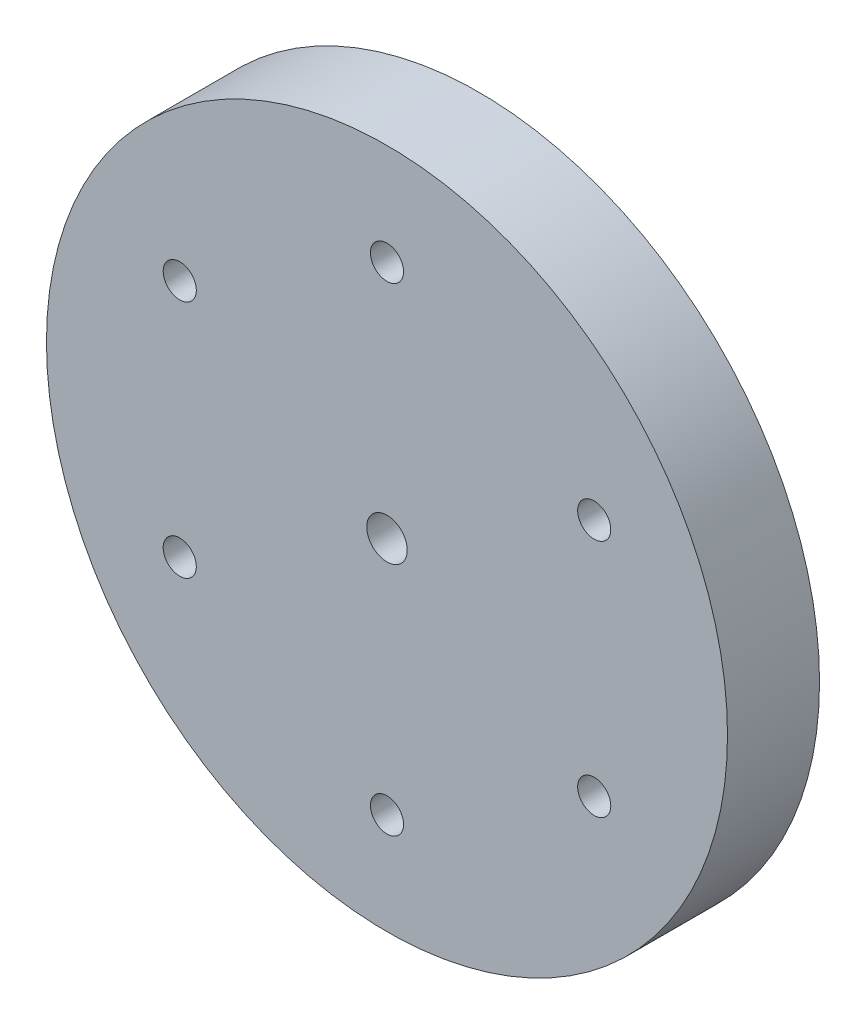
ISO-10303-21;
HEADER;
FILE_DESCRIPTION(('STEP AP214'),'2;1');
FILE_NAME('part.step','',(''),(''),'','','');
FILE_SCHEMA(('AUTOMOTIVE_DESIGN { 1 0 10303 214 1 1 1 1 }'));
ENDSEC;
DATA;
#1=APPLICATION_CONTEXT('core data for automotive mechanical design processes');
#2=APPLICATION_PROTOCOL_DEFINITION('international standard','automotive_design',2000,#1);
#3=PRODUCT_CONTEXT('',#1,'mechanical');
#4=PRODUCT('Part','Part','',(#3));
#5=PRODUCT_RELATED_PRODUCT_CATEGORY('part','',(#4));
#6=PRODUCT_DEFINITION_FORMATION('','',#4);
#7=PRODUCT_DEFINITION_CONTEXT('part definition',#1,'design');
#8=PRODUCT_DEFINITION('design','',#6,#7);
#9=PRODUCT_DEFINITION_SHAPE('','',#8);
#10=(LENGTH_UNIT() NAMED_UNIT(*) SI_UNIT(.MILLI.,.METRE.));
#11=(NAMED_UNIT(*) PLANE_ANGLE_UNIT() SI_UNIT($,.RADIAN.));
#12=(NAMED_UNIT(*) SI_UNIT($,.STERADIAN.) SOLID_ANGLE_UNIT());
#13=UNCERTAINTY_MEASURE_WITH_UNIT(LENGTH_MEASURE(1.E-05),#10,'distance_accuracy_value','');
#14=(GEOMETRIC_REPRESENTATION_CONTEXT(3) GLOBAL_UNCERTAINTY_ASSIGNED_CONTEXT((#13)) GLOBAL_UNIT_ASSIGNED_CONTEXT((#10,
#11,#12)) REPRESENTATION_CONTEXT('',''));
#15=CARTESIAN_POINT('',(0.,0.,0.));
#16=DIRECTION('',(0.,0.,1.));
#17=DIRECTION('',(1.,0.,0.));
#18=AXIS2_PLACEMENT_3D('',#15,#16,#17);
#19=CARTESIAN_POINT('',(0.,0.,2.5));
#20=DIRECTION('',(0.,0.,1.));
#21=DIRECTION('',(1.,0.,0.));
#22=AXIS2_PLACEMENT_3D('',#19,#20,#21);
#23=PLANE('',#22);
#24=CARTESIAN_POINT('',(-11.2583302491976,6.50000000000013,2.5));
#25=DIRECTION('',(0.,0.,1.));
#26=DIRECTION('',(0.50000000000001,0.866025403784433,0.));
#27=AXIS2_PLACEMENT_3D('',#24,#25,#26);
#28=CIRCLE('',#27,0.9);
#29=CARTESIAN_POINT('',(-10.8083302491976,7.27942286340612,2.5));
#30=VERTEX_POINT('',#29);
#31=EDGE_CURVE('E74',#30,#30,#28,.T.);
#32=ORIENTED_EDGE('',*,*,#31,.F.);
#33=EDGE_LOOP('',(#32));
#34=FACE_BOUND('',#33,.T.);
#35=CARTESIAN_POINT('',(-11.2583302491978,-6.4999999999999,2.5));
#36=DIRECTION('',(0.,0.,1.));
#37=DIRECTION('',(-0.499999999999992,0.866025403784443,0.));
#38=AXIS2_PLACEMENT_3D('',#35,#36,#37);
#39=CIRCLE('',#38,0.9);
#40=CARTESIAN_POINT('',(-11.7083302491978,-5.7205771365939,2.5));
#41=VERTEX_POINT('',#40);
#42=EDGE_CURVE('E80',#41,#41,#39,.T.);
#43=ORIENTED_EDGE('',*,*,#42,.F.);
#44=EDGE_LOOP('',(#43));
#45=FACE_BOUND('',#44,.T.);
#46=CARTESIAN_POINT('',(0.,-13.,2.5));
#47=DIRECTION('',(0.,0.,1.));
#48=DIRECTION('',(-1.,0.,0.));
#49=AXIS2_PLACEMENT_3D('',#46,#47,#48);
#50=CIRCLE('',#49,0.9);
#51=CARTESIAN_POINT('',(-0.9,-13.,2.5));
#52=VERTEX_POINT('',#51);
#53=EDGE_CURVE('E86',#52,#52,#50,.T.);
#54=ORIENTED_EDGE('',*,*,#53,.F.);
#55=EDGE_LOOP('',(#54));
#56=FACE_BOUND('',#55,.T.);
#57=CARTESIAN_POINT('',(11.2583302491977,-6.50000000000005,2.5));
#58=DIRECTION('',(0.,0.,1.));
#59=DIRECTION('',(-0.500000000000004,-0.866025403784436,0.));
#60=AXIS2_PLACEMENT_3D('',#57,#58,#59);
#61=CIRCLE('',#60,0.9);
#62=CARTESIAN_POINT('',(10.8083302491977,-7.27942286340605,2.5));
#63=VERTEX_POINT('',#62);
#64=EDGE_CURVE('E92',#63,#63,#61,.T.);
#65=ORIENTED_EDGE('',*,*,#64,.F.);
#66=EDGE_LOOP('',(#65));
#67=FACE_BOUND('',#66,.T.);
#68=CARTESIAN_POINT('',(11.2583302491977,6.49999999999997,2.5));
#69=DIRECTION('',(0.,0.,1.));
#70=DIRECTION('',(0.499999999999998,-0.86602540378444,0.));
#71=AXIS2_PLACEMENT_3D('',#68,#69,#70);
#72=CIRCLE('',#71,0.9);
#73=CARTESIAN_POINT('',(11.7083302491977,5.72057713659398,2.5));
#74=VERTEX_POINT('',#73);
#75=EDGE_CURVE('E68',#74,#74,#72,.T.);
#76=ORIENTED_EDGE('',*,*,#75,.F.);
#77=EDGE_LOOP('',(#76));
#78=FACE_BOUND('',#77,.T.);
#79=CARTESIAN_POINT('',(0.,13.,2.5));
#80=DIRECTION('',(0.,0.,1.));
#81=DIRECTION('',(1.,0.,0.));
#82=AXIS2_PLACEMENT_3D('',#79,#80,#81);
#83=CIRCLE('',#82,0.9);
#84=CARTESIAN_POINT('',(0.9,13.,2.5));
#85=VERTEX_POINT('',#84);
#86=EDGE_CURVE('E62',#85,#85,#83,.T.);
#87=ORIENTED_EDGE('',*,*,#86,.F.);
#88=EDGE_LOOP('',(#87));
#89=FACE_BOUND('',#88,.T.);
#90=CARTESIAN_POINT('',(0.,0.,2.5));
#91=DIRECTION('',(0.,0.,1.));
#92=DIRECTION('',(1.,0.,0.));
#93=AXIS2_PLACEMENT_3D('',#90,#91,#92);
#94=CIRCLE('',#93,18.5);
#95=CARTESIAN_POINT('',(18.5,0.,2.5));
#96=VERTEX_POINT('',#95);
#97=EDGE_CURVE('E11',#96,#96,#94,.T.);
#98=ORIENTED_EDGE('',*,*,#97,.T.);
#99=EDGE_LOOP('',(#98));
#100=FACE_BOUND('',#99,.T.);
#101=CARTESIAN_POINT('',(0.,0.,2.5));
#102=DIRECTION('',(0.,0.,1.));
#103=DIRECTION('',(1.,0.,0.));
#104=AXIS2_PLACEMENT_3D('',#101,#102,#103);
#105=CIRCLE('',#104,1.1);
#106=CARTESIAN_POINT('',(1.1,0.,2.5));
#107=VERTEX_POINT('',#106);
#108=EDGE_CURVE('E54',#107,#107,#105,.T.);
#109=ORIENTED_EDGE('',*,*,#108,.F.);
#110=EDGE_LOOP('',(#109));
#111=FACE_BOUND('',#110,.T.);
#112=ADVANCED_FACE('F43',(#34,#45,#56,#67,#78,#89,#100,#111),#23,.T.);
#113=CARTESIAN_POINT('',(0.,0.,-2.5));
#114=DIRECTION('',(0.,0.,1.));
#115=DIRECTION('',(1.,0.,0.));
#116=AXIS2_PLACEMENT_3D('',#113,#114,#115);
#117=PLANE('',#116);
#118=CARTESIAN_POINT('',(-11.2583302491976,6.50000000000013,-2.5));
#119=DIRECTION('',(0.,0.,1.));
#120=DIRECTION('',(0.50000000000001,0.866025403784433,0.));
#121=AXIS2_PLACEMENT_3D('',#118,#119,#120);
#122=CIRCLE('',#121,0.9);
#123=CARTESIAN_POINT('',(-10.8083302491976,7.27942286340612,-2.5));
#124=VERTEX_POINT('',#123);
#125=EDGE_CURVE('E77',#124,#124,#122,.T.);
#126=ORIENTED_EDGE('',*,*,#125,.T.);
#127=EDGE_LOOP('',(#126));
#128=FACE_BOUND('',#127,.T.);
#129=CARTESIAN_POINT('',(-11.2583302491978,-6.4999999999999,-2.5));
#130=DIRECTION('',(0.,0.,1.));
#131=DIRECTION('',(-0.499999999999992,0.866025403784443,0.));
#132=AXIS2_PLACEMENT_3D('',#129,#130,#131);
#133=CIRCLE('',#132,0.9);
#134=CARTESIAN_POINT('',(-11.7083302491978,-5.7205771365939,-2.5));
#135=VERTEX_POINT('',#134);
#136=EDGE_CURVE('E83',#135,#135,#133,.T.);
#137=ORIENTED_EDGE('',*,*,#136,.T.);
#138=EDGE_LOOP('',(#137));
#139=FACE_BOUND('',#138,.T.);
#140=CARTESIAN_POINT('',(0.,-13.,-2.5));
#141=DIRECTION('',(0.,0.,1.));
#142=DIRECTION('',(-1.,0.,0.));
#143=AXIS2_PLACEMENT_3D('',#140,#141,#142);
#144=CIRCLE('',#143,0.9);
#145=CARTESIAN_POINT('',(-0.9,-13.,-2.5));
#146=VERTEX_POINT('',#145);
#147=EDGE_CURVE('E89',#146,#146,#144,.T.);
#148=ORIENTED_EDGE('',*,*,#147,.T.);
#149=EDGE_LOOP('',(#148));
#150=FACE_BOUND('',#149,.T.);
#151=CARTESIAN_POINT('',(11.2583302491977,-6.50000000000005,-2.5));
#152=DIRECTION('',(0.,0.,1.));
#153=DIRECTION('',(-0.500000000000004,-0.866025403784436,0.));
#154=AXIS2_PLACEMENT_3D('',#151,#152,#153);
#155=CIRCLE('',#154,0.9);
#156=CARTESIAN_POINT('',(10.8083302491977,-7.27942286340605,-2.5));
#157=VERTEX_POINT('',#156);
#158=EDGE_CURVE('E71',#157,#157,#155,.T.);
#159=ORIENTED_EDGE('',*,*,#158,.T.);
#160=EDGE_LOOP('',(#159));
#161=FACE_BOUND('',#160,.T.);
#162=CARTESIAN_POINT('',(11.2583302491977,6.49999999999997,-2.5));
#163=DIRECTION('',(0.,0.,1.));
#164=DIRECTION('',(0.499999999999998,-0.86602540378444,0.));
#165=AXIS2_PLACEMENT_3D('',#162,#163,#164);
#166=CIRCLE('',#165,0.9);
#167=CARTESIAN_POINT('',(11.7083302491977,5.72057713659398,-2.5));
#168=VERTEX_POINT('',#167);
#169=EDGE_CURVE('E65',#168,#168,#166,.T.);
#170=ORIENTED_EDGE('',*,*,#169,.T.);
#171=EDGE_LOOP('',(#170));
#172=FACE_BOUND('',#171,.T.);
#173=CARTESIAN_POINT('',(0.,13.,-2.5));
#174=DIRECTION('',(0.,0.,1.));
#175=DIRECTION('',(1.,0.,0.));
#176=AXIS2_PLACEMENT_3D('',#173,#174,#175);
#177=CIRCLE('',#176,0.9);
#178=CARTESIAN_POINT('',(0.9,13.,-2.5));
#179=VERTEX_POINT('',#178);
#180=EDGE_CURVE('E59',#179,#179,#177,.T.);
#181=ORIENTED_EDGE('',*,*,#180,.T.);
#182=EDGE_LOOP('',(#181));
#183=FACE_BOUND('',#182,.T.);
#184=CARTESIAN_POINT('',(0.,0.,-2.5));
#185=DIRECTION('',(0.,0.,1.));
#186=DIRECTION('',(1.,0.,0.));
#187=AXIS2_PLACEMENT_3D('',#184,#185,#186);
#188=CIRCLE('',#187,18.5);
#189=CARTESIAN_POINT('',(18.5,0.,-2.5));
#190=VERTEX_POINT('',#189);
#191=EDGE_CURVE('E47',#190,#190,#188,.T.);
#192=ORIENTED_EDGE('',*,*,#191,.F.);
#193=EDGE_LOOP('',(#192));
#194=FACE_BOUND('',#193,.T.);
#195=CARTESIAN_POINT('',(0.,0.,-2.5));
#196=DIRECTION('',(0.,0.,1.));
#197=DIRECTION('',(1.,0.,0.));
#198=AXIS2_PLACEMENT_3D('',#195,#196,#197);
#199=CIRCLE('',#198,1.1);
#200=CARTESIAN_POINT('',(1.1,0.,-2.5));
#201=VERTEX_POINT('',#200);
#202=EDGE_CURVE('E56',#201,#201,#199,.T.);
#203=ORIENTED_EDGE('',*,*,#202,.T.);
#204=EDGE_LOOP('',(#203));
#205=FACE_BOUND('',#204,.T.);
#206=ADVANCED_FACE('F98',(#128,#139,#150,#161,#172,#183,#194,#205),#117,.F.);
#207=CARTESIAN_POINT('',(0.,0.,2.5));
#208=DIRECTION('',(0.,0.,-1.));
#209=DIRECTION('',(-1.,0.,0.));
#210=AXIS2_PLACEMENT_3D('',#207,#208,#209);
#211=CYLINDRICAL_SURFACE('',#210,18.5);
#212=ORIENTED_EDGE('',*,*,#97,.F.);
#213=EDGE_LOOP('',(#212));
#214=FACE_BOUND('',#213,.T.);
#215=ORIENTED_EDGE('',*,*,#191,.T.);
#216=EDGE_LOOP('',(#215));
#217=FACE_BOUND('',#216,.T.);
#218=ADVANCED_FACE('F45',(#214,#217),#211,.T.);
#219=CARTESIAN_POINT('',(0.,0.,2.5));
#220=DIRECTION('',(0.,0.,-1.));
#221=DIRECTION('',(-1.,0.,0.));
#222=AXIS2_PLACEMENT_3D('',#219,#220,#221);
#223=CYLINDRICAL_SURFACE('',#222,1.1);
#224=ORIENTED_EDGE('',*,*,#108,.T.);
#225=EDGE_LOOP('',(#224));
#226=FACE_BOUND('',#225,.T.);
#227=ORIENTED_EDGE('',*,*,#202,.F.);
#228=EDGE_LOOP('',(#227));
#229=FACE_BOUND('',#228,.T.);
#230=ADVANCED_FACE('F119',(#226,#229),#223,.F.);
#231=CARTESIAN_POINT('',(0.,13.,-2.5));
#232=DIRECTION('',(0.,0.,1.));
#233=DIRECTION('',(1.,0.,0.));
#234=AXIS2_PLACEMENT_3D('',#231,#232,#233);
#235=CYLINDRICAL_SURFACE('',#234,0.9);
#236=ORIENTED_EDGE('',*,*,#180,.F.);
#237=EDGE_LOOP('',(#236));
#238=FACE_BOUND('',#237,.T.);
#239=ORIENTED_EDGE('',*,*,#86,.T.);
#240=EDGE_LOOP('',(#239));
#241=FACE_BOUND('',#240,.T.);
#242=ADVANCED_FACE('F122',(#238,#241),#235,.F.);
#243=CARTESIAN_POINT('',(11.2583302491977,6.49999999999997,-2.5));
#244=DIRECTION('',(0.,0.,1.));
#245=DIRECTION('',(1.,0.,0.));
#246=AXIS2_PLACEMENT_3D('',#243,#244,#245);
#247=CYLINDRICAL_SURFACE('',#246,0.9);
#248=ORIENTED_EDGE('',*,*,#169,.F.);
#249=EDGE_LOOP('',(#248));
#250=FACE_BOUND('',#249,.T.);
#251=ORIENTED_EDGE('',*,*,#75,.T.);
#252=EDGE_LOOP('',(#251));
#253=FACE_BOUND('',#252,.T.);
#254=ADVANCED_FACE('F105',(#250,#253),#247,.F.);
#255=CARTESIAN_POINT('',(11.2583302491977,-6.50000000000005,-2.5));
#256=DIRECTION('',(0.,0.,1.));
#257=DIRECTION('',(1.,0.,0.));
#258=AXIS2_PLACEMENT_3D('',#255,#256,#257);
#259=CYLINDRICAL_SURFACE('',#258,0.9);
#260=ORIENTED_EDGE('',*,*,#158,.F.);
#261=EDGE_LOOP('',(#260));
#262=FACE_BOUND('',#261,.T.);
#263=ORIENTED_EDGE('',*,*,#64,.T.);
#264=EDGE_LOOP('',(#263));
#265=FACE_BOUND('',#264,.T.);
#266=ADVANCED_FACE('F101',(#262,#265),#259,.F.);
#267=CARTESIAN_POINT('',(0.,-13.,-2.5));
#268=DIRECTION('',(0.,0.,1.));
#269=DIRECTION('',(1.,0.,0.));
#270=AXIS2_PLACEMENT_3D('',#267,#268,#269);
#271=CYLINDRICAL_SURFACE('',#270,0.9);
#272=ORIENTED_EDGE('',*,*,#147,.F.);
#273=EDGE_LOOP('',(#272));
#274=FACE_BOUND('',#273,.T.);
#275=ORIENTED_EDGE('',*,*,#53,.T.);
#276=EDGE_LOOP('',(#275));
#277=FACE_BOUND('',#276,.T.);
#278=ADVANCED_FACE('F104',(#274,#277),#271,.F.);
#279=CARTESIAN_POINT('',(-11.2583302491978,-6.4999999999999,-2.5));
#280=DIRECTION('',(0.,0.,1.));
#281=DIRECTION('',(1.,0.,0.));
#282=AXIS2_PLACEMENT_3D('',#279,#280,#281);
#283=CYLINDRICAL_SURFACE('',#282,0.9);
#284=ORIENTED_EDGE('',*,*,#136,.F.);
#285=EDGE_LOOP('',(#284));
#286=FACE_BOUND('',#285,.T.);
#287=ORIENTED_EDGE('',*,*,#42,.T.);
#288=EDGE_LOOP('',(#287));
#289=FACE_BOUND('',#288,.T.);
#290=ADVANCED_FACE('F143',(#286,#289),#283,.F.);
#291=CARTESIAN_POINT('',(-11.2583302491976,6.50000000000013,-2.5));
#292=DIRECTION('',(0.,0.,1.));
#293=DIRECTION('',(1.,0.,0.));
#294=AXIS2_PLACEMENT_3D('',#291,#292,#293);
#295=CYLINDRICAL_SURFACE('',#294,0.9);
#296=ORIENTED_EDGE('',*,*,#125,.F.);
#297=EDGE_LOOP('',(#296));
#298=FACE_BOUND('',#297,.T.);
#299=ORIENTED_EDGE('',*,*,#31,.T.);
#300=EDGE_LOOP('',(#299));
#301=FACE_BOUND('',#300,.T.);
#302=ADVANCED_FACE('F140',(#298,#301),#295,.F.);
#303=CLOSED_SHELL('',(#112,#206,#218,#230,#242,#254,#266,#278,#290,#302));
#304=MANIFOLD_SOLID_BREP('B2',#303);
#305=ADVANCED_BREP_SHAPE_REPRESENTATION('',(#18,#304),#14);
#306=SHAPE_DEFINITION_REPRESENTATION(#9,#305);
ENDSEC;
END-ISO-10303-21;
